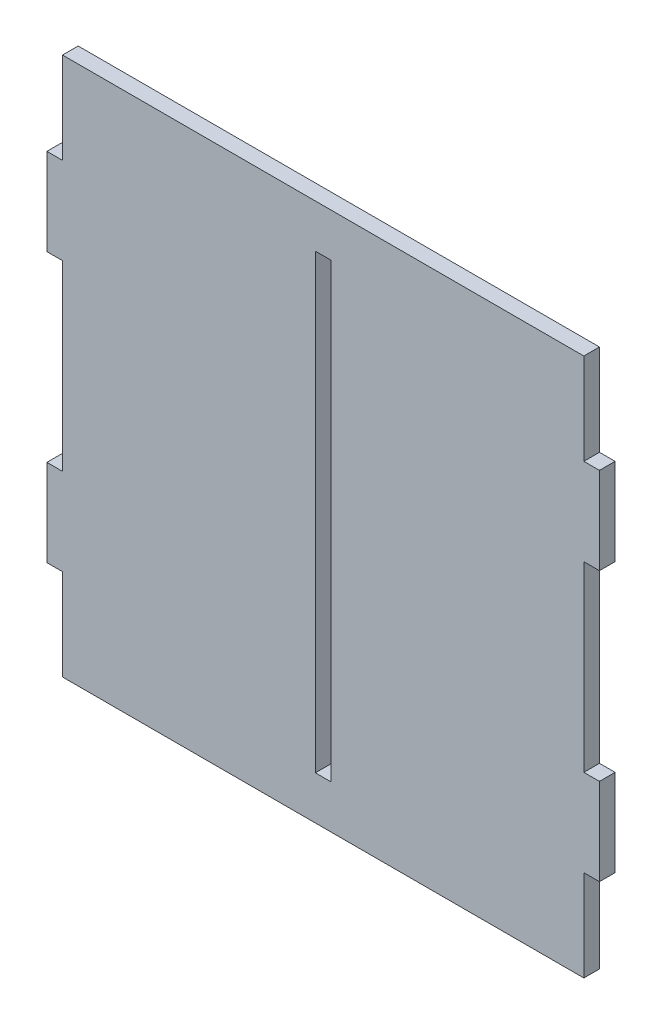
ISO-10303-21;
HEADER;
FILE_DESCRIPTION(('STEP AP214'),'2;1');
FILE_NAME('part.step','',(''),(''),'','','');
FILE_SCHEMA(('AUTOMOTIVE_DESIGN { 1 0 10303 214 1 1 1 1 }'));
ENDSEC;
DATA;
#1=APPLICATION_CONTEXT('core data for automotive mechanical design processes');
#2=APPLICATION_PROTOCOL_DEFINITION('international standard','automotive_design',2000,#1);
#3=PRODUCT_CONTEXT('',#1,'mechanical');
#4=PRODUCT('Part','Part','',(#3));
#5=PRODUCT_RELATED_PRODUCT_CATEGORY('part','',(#4));
#6=PRODUCT_DEFINITION_FORMATION('','',#4);
#7=PRODUCT_DEFINITION_CONTEXT('part definition',#1,'design');
#8=PRODUCT_DEFINITION('design','',#6,#7);
#9=PRODUCT_DEFINITION_SHAPE('','',#8);
#10=(LENGTH_UNIT() NAMED_UNIT(*) SI_UNIT(.MILLI.,.METRE.));
#11=(NAMED_UNIT(*) PLANE_ANGLE_UNIT() SI_UNIT($,.RADIAN.));
#12=(NAMED_UNIT(*) SI_UNIT($,.STERADIAN.) SOLID_ANGLE_UNIT());
#13=UNCERTAINTY_MEASURE_WITH_UNIT(LENGTH_MEASURE(1.E-05),#10,'distance_accuracy_value','');
#14=(GEOMETRIC_REPRESENTATION_CONTEXT(3) GLOBAL_UNCERTAINTY_ASSIGNED_CONTEXT((#13)) GLOBAL_UNIT_ASSIGNED_CONTEXT((#10,
#11,#12)) REPRESENTATION_CONTEXT('',''));
#15=CARTESIAN_POINT('',(0.,0.,0.));
#16=DIRECTION('',(0.,0.,1.));
#17=DIRECTION('',(1.,0.,0.));
#18=AXIS2_PLACEMENT_3D('',#15,#16,#17);
#19=CARTESIAN_POINT('',(0.,0.,18.));
#20=DIRECTION('',(0.,0.,1.));
#21=DIRECTION('',(1.,0.,0.));
#22=AXIS2_PLACEMENT_3D('',#19,#20,#21);
#23=PLANE('',#22);
#24=DIRECTION('',(0.,-1.,0.));
#25=VECTOR('',#24,1.);
#26=CARTESIAN_POINT('',(0.,0.,18.));
#27=LINE('',#26,#25);
#28=CARTESIAN_POINT('',(0.,0.,18.));
#29=VERTEX_POINT('',#28);
#30=CARTESIAN_POINT('',(0.,-105.,18.));
#31=VERTEX_POINT('',#30);
#32=EDGE_CURVE('E221',#29,#31,#27,.T.);
#33=ORIENTED_EDGE('',*,*,#32,.T.);
#34=DIRECTION('',(1.,0.,0.));
#35=VECTOR('',#34,1.);
#36=CARTESIAN_POINT('',(-18.,-105.,18.));
#37=LINE('',#36,#35);
#38=CARTESIAN_POINT('',(-18.,-105.,18.));
#39=VERTEX_POINT('',#38);
#40=EDGE_CURVE('E223',#39,#31,#37,.T.);
#41=ORIENTED_EDGE('',*,*,#40,.F.);
#42=DIRECTION('',(0.,-1.,0.));
#43=VECTOR('',#42,1.);
#44=CARTESIAN_POINT('',(-18.,-105.,18.));
#45=LINE('',#44,#43);
#46=CARTESIAN_POINT('',(-18.,-205.,18.));
#47=VERTEX_POINT('',#46);
#48=EDGE_CURVE('E227',#39,#47,#45,.T.);
#49=ORIENTED_EDGE('',*,*,#48,.T.);
#50=DIRECTION('',(1.,0.,0.));
#51=VECTOR('',#50,1.);
#52=CARTESIAN_POINT('',(-18.,-205.,18.));
#53=LINE('',#52,#51);
#54=CARTESIAN_POINT('',(0.,-205.,18.));
#55=VERTEX_POINT('',#54);
#56=EDGE_CURVE('E229',#47,#55,#53,.T.);
#57=ORIENTED_EDGE('',*,*,#56,.T.);
#58=DIRECTION('',(0.,-1.,0.));
#59=VECTOR('',#58,1.);
#60=CARTESIAN_POINT('',(0.,-205.,18.));
#61=LINE('',#60,#59);
#62=CARTESIAN_POINT('',(0.,-415.,18.));
#63=VERTEX_POINT('',#62);
#64=EDGE_CURVE('E231',#55,#63,#61,.T.);
#65=ORIENTED_EDGE('',*,*,#64,.T.);
#66=DIRECTION('',(1.,0.,0.));
#67=VECTOR('',#66,1.);
#68=CARTESIAN_POINT('',(-18.,-415.,18.));
#69=LINE('',#68,#67);
#70=CARTESIAN_POINT('',(-18.,-415.,18.));
#71=VERTEX_POINT('',#70);
#72=EDGE_CURVE('E233',#71,#63,#69,.T.);
#73=ORIENTED_EDGE('',*,*,#72,.F.);
#74=DIRECTION('',(0.,1.,0.));
#75=VECTOR('',#74,1.);
#76=CARTESIAN_POINT('',(-18.,-515.,18.));
#77=LINE('',#76,#75);
#78=CARTESIAN_POINT('',(-18.,-515.,18.));
#79=VERTEX_POINT('',#78);
#80=EDGE_CURVE('E236',#79,#71,#77,.T.);
#81=ORIENTED_EDGE('',*,*,#80,.F.);
#82=DIRECTION('',(1.,0.,0.));
#83=VECTOR('',#82,1.);
#84=CARTESIAN_POINT('',(-18.,-515.,18.));
#85=LINE('',#84,#83);
#86=CARTESIAN_POINT('',(0.,-515.,18.));
#87=VERTEX_POINT('',#86);
#88=EDGE_CURVE('E239',#79,#87,#85,.T.);
#89=ORIENTED_EDGE('',*,*,#88,.T.);
#90=DIRECTION('',(0.,1.,0.));
#91=VECTOR('',#90,1.);
#92=CARTESIAN_POINT('',(0.,-620.,18.));
#93=LINE('',#92,#91);
#94=CARTESIAN_POINT('',(0.,-620.,18.));
#95=VERTEX_POINT('',#94);
#96=EDGE_CURVE('E241',#95,#87,#93,.T.);
#97=ORIENTED_EDGE('',*,*,#96,.F.);
#98=DIRECTION('',(1.,0.,0.));
#99=VECTOR('',#98,1.);
#100=CARTESIAN_POINT('',(0.,-620.,18.));
#101=LINE('',#100,#99);
#102=CARTESIAN_POINT('',(600.,-620.,18.));
#103=VERTEX_POINT('',#102);
#104=EDGE_CURVE('E244',#95,#103,#101,.T.);
#105=ORIENTED_EDGE('',*,*,#104,.T.);
#106=DIRECTION('',(0.,1.,0.));
#107=VECTOR('',#106,1.);
#108=CARTESIAN_POINT('',(600.,-620.,18.));
#109=LINE('',#108,#107);
#110=CARTESIAN_POINT('',(600.,-515.,18.));
#111=VERTEX_POINT('',#110);
#112=EDGE_CURVE('E246',#103,#111,#109,.T.);
#113=ORIENTED_EDGE('',*,*,#112,.T.);
#114=DIRECTION('',(-1.,0.,0.));
#115=VECTOR('',#114,1.);
#116=CARTESIAN_POINT('',(618.,-515.,18.));
#117=LINE('',#116,#115);
#118=CARTESIAN_POINT('',(618.,-515.,18.));
#119=VERTEX_POINT('',#118);
#120=EDGE_CURVE('E248',#119,#111,#117,.T.);
#121=ORIENTED_EDGE('',*,*,#120,.F.);
#122=DIRECTION('',(0.,1.,0.));
#123=VECTOR('',#122,1.);
#124=CARTESIAN_POINT('',(618.,-515.,18.));
#125=LINE('',#124,#123);
#126=CARTESIAN_POINT('',(618.,-415.,18.));
#127=VERTEX_POINT('',#126);
#128=EDGE_CURVE('E251',#119,#127,#125,.T.);
#129=ORIENTED_EDGE('',*,*,#128,.T.);
#130=DIRECTION('',(-1.,0.,0.));
#131=VECTOR('',#130,1.);
#132=CARTESIAN_POINT('',(618.,-415.,18.));
#133=LINE('',#132,#131);
#134=CARTESIAN_POINT('',(600.,-415.,18.));
#135=VERTEX_POINT('',#134);
#136=EDGE_CURVE('E253',#127,#135,#133,.T.);
#137=ORIENTED_EDGE('',*,*,#136,.T.);
#138=DIRECTION('',(0.,-1.,0.));
#139=VECTOR('',#138,1.);
#140=CARTESIAN_POINT('',(600.,-205.,18.));
#141=LINE('',#140,#139);
#142=CARTESIAN_POINT('',(600.,-205.,18.));
#143=VERTEX_POINT('',#142);
#144=EDGE_CURVE('E255',#143,#135,#141,.T.);
#145=ORIENTED_EDGE('',*,*,#144,.F.);
#146=DIRECTION('',(-1.,0.,0.));
#147=VECTOR('',#146,1.);
#148=CARTESIAN_POINT('',(618.,-205.,18.));
#149=LINE('',#148,#147);
#150=CARTESIAN_POINT('',(618.,-205.,18.));
#151=VERTEX_POINT('',#150);
#152=EDGE_CURVE('E258',#151,#143,#149,.T.);
#153=ORIENTED_EDGE('',*,*,#152,.F.);
#154=DIRECTION('',(0.,-1.,0.));
#155=VECTOR('',#154,1.);
#156=CARTESIAN_POINT('',(618.,-105.,18.));
#157=LINE('',#156,#155);
#158=CARTESIAN_POINT('',(618.,-105.,18.));
#159=VERTEX_POINT('',#158);
#160=EDGE_CURVE('E261',#159,#151,#157,.T.);
#161=ORIENTED_EDGE('',*,*,#160,.F.);
#162=DIRECTION('',(-1.,0.,0.));
#163=VECTOR('',#162,1.);
#164=CARTESIAN_POINT('',(618.,-105.,18.));
#165=LINE('',#164,#163);
#166=CARTESIAN_POINT('',(600.,-105.,18.));
#167=VERTEX_POINT('',#166);
#168=EDGE_CURVE('E264',#159,#167,#165,.T.);
#169=ORIENTED_EDGE('',*,*,#168,.T.);
#170=DIRECTION('',(0.,-1.,0.));
#171=VECTOR('',#170,1.);
#172=CARTESIAN_POINT('',(600.,0.,18.));
#173=LINE('',#172,#171);
#174=CARTESIAN_POINT('',(600.,0.,18.));
#175=VERTEX_POINT('',#174);
#176=EDGE_CURVE('E266',#175,#167,#173,.T.);
#177=ORIENTED_EDGE('',*,*,#176,.F.);
#178=DIRECTION('',(1.,0.,0.));
#179=VECTOR('',#178,1.);
#180=CARTESIAN_POINT('',(0.,0.,18.));
#181=LINE('',#180,#179);
#182=EDGE_CURVE('E269',#29,#175,#181,.T.);
#183=ORIENTED_EDGE('',*,*,#182,.F.);
#184=EDGE_LOOP('',(#33,#41,#49,#57,#65,#73,#81,#89,#97,#105,#113,#121,#129,#137,#145,#153,#161,
#169,#177,#183));
#185=FACE_BOUND('',#184,.T.);
#186=DIRECTION('',(1.,0.,0.));
#187=VECTOR('',#186,1.);
#188=CARTESIAN_POINT('',(291.,-570.000000000002,18.));
#189=LINE('',#188,#187);
#190=CARTESIAN_POINT('',(291.,-570.000000000002,18.));
#191=VERTEX_POINT('',#190);
#192=CARTESIAN_POINT('',(309.,-570.000000000001,18.));
#193=VERTEX_POINT('',#192);
#194=EDGE_CURVE('E203',#191,#193,#189,.T.);
#195=ORIENTED_EDGE('',*,*,#194,.F.);
#196=DIRECTION('',(0.,-1.,0.));
#197=VECTOR('',#196,1.);
#198=CARTESIAN_POINT('',(291.,-50.0000000000002,18.));
#199=LINE('',#198,#197);
#200=CARTESIAN_POINT('',(291.,-50.0000000000002,18.));
#201=VERTEX_POINT('',#200);
#202=EDGE_CURVE('E195',#201,#191,#199,.T.);
#203=ORIENTED_EDGE('',*,*,#202,.F.);
#204=DIRECTION('',(1.,0.,0.));
#205=VECTOR('',#204,1.);
#206=CARTESIAN_POINT('',(291.,-50.0000000000002,18.));
#207=LINE('',#206,#205);
#208=CARTESIAN_POINT('',(309.,-50.0000000000002,18.));
#209=VERTEX_POINT('',#208);
#210=EDGE_CURVE('E213',#201,#209,#207,.T.);
#211=ORIENTED_EDGE('',*,*,#210,.T.);
#212=DIRECTION('',(0.,-1.,0.));
#213=VECTOR('',#212,1.);
#214=CARTESIAN_POINT('',(309.,-50.0000000000002,18.));
#215=LINE('',#214,#213);
#216=EDGE_CURVE('E48',#209,#193,#215,.T.);
#217=ORIENTED_EDGE('',*,*,#216,.T.);
#218=EDGE_LOOP('',(#195,#203,#211,#217));
#219=FACE_BOUND('',#218,.T.);
#220=ADVANCED_FACE('F33',(#185,#219),#23,.T.);
#221=CARTESIAN_POINT('',(0.,0.,0.));
#222=DIRECTION('',(0.,0.,1.));
#223=DIRECTION('',(1.,0.,0.));
#224=AXIS2_PLACEMENT_3D('',#221,#222,#223);
#225=PLANE('',#224);
#226=DIRECTION('',(0.,-1.,0.));
#227=VECTOR('',#226,1.);
#228=CARTESIAN_POINT('',(0.,0.,0.));
#229=LINE('',#228,#227);
#230=CARTESIAN_POINT('',(0.,0.,0.));
#231=VERTEX_POINT('',#230);
#232=CARTESIAN_POINT('',(0.,-105.,0.));
#233=VERTEX_POINT('',#232);
#234=EDGE_CURVE('E209',#231,#233,#229,.T.);
#235=ORIENTED_EDGE('',*,*,#234,.F.);
#236=DIRECTION('',(1.,0.,0.));
#237=VECTOR('',#236,1.);
#238=CARTESIAN_POINT('',(0.,0.,0.));
#239=LINE('',#238,#237);
#240=CARTESIAN_POINT('',(600.,0.,0.));
#241=VERTEX_POINT('',#240);
#242=EDGE_CURVE('E224',#231,#241,#239,.T.);
#243=ORIENTED_EDGE('',*,*,#242,.T.);
#244=DIRECTION('',(0.,-1.,0.));
#245=VECTOR('',#244,1.);
#246=CARTESIAN_POINT('',(600.,0.,0.));
#247=LINE('',#246,#245);
#248=CARTESIAN_POINT('',(600.,-105.,0.));
#249=VERTEX_POINT('',#248);
#250=EDGE_CURVE('E322',#241,#249,#247,.T.);
#251=ORIENTED_EDGE('',*,*,#250,.T.);
#252=DIRECTION('',(-1.,0.,0.));
#253=VECTOR('',#252,1.);
#254=CARTESIAN_POINT('',(618.,-105.,0.));
#255=LINE('',#254,#253);
#256=CARTESIAN_POINT('',(618.,-105.,0.));
#257=VERTEX_POINT('',#256);
#258=EDGE_CURVE('E319',#257,#249,#255,.T.);
#259=ORIENTED_EDGE('',*,*,#258,.F.);
#260=DIRECTION('',(0.,-1.,0.));
#261=VECTOR('',#260,1.);
#262=CARTESIAN_POINT('',(618.,-105.,0.));
#263=LINE('',#262,#261);
#264=CARTESIAN_POINT('',(618.,-205.,0.));
#265=VERTEX_POINT('',#264);
#266=EDGE_CURVE('E316',#257,#265,#263,.T.);
#267=ORIENTED_EDGE('',*,*,#266,.T.);
#268=DIRECTION('',(-1.,0.,0.));
#269=VECTOR('',#268,1.);
#270=CARTESIAN_POINT('',(618.,-205.,0.));
#271=LINE('',#270,#269);
#272=CARTESIAN_POINT('',(600.,-205.,0.));
#273=VERTEX_POINT('',#272);
#274=EDGE_CURVE('E313',#265,#273,#271,.T.);
#275=ORIENTED_EDGE('',*,*,#274,.T.);
#276=DIRECTION('',(0.,-1.,0.));
#277=VECTOR('',#276,1.);
#278=CARTESIAN_POINT('',(600.,-205.,0.));
#279=LINE('',#278,#277);
#280=CARTESIAN_POINT('',(600.,-415.,0.));
#281=VERTEX_POINT('',#280);
#282=EDGE_CURVE('E310',#273,#281,#279,.T.);
#283=ORIENTED_EDGE('',*,*,#282,.T.);
#284=DIRECTION('',(-1.,0.,0.));
#285=VECTOR('',#284,1.);
#286=CARTESIAN_POINT('',(618.,-415.,0.));
#287=LINE('',#286,#285);
#288=CARTESIAN_POINT('',(618.,-415.,0.));
#289=VERTEX_POINT('',#288);
#290=EDGE_CURVE('E307',#289,#281,#287,.T.);
#291=ORIENTED_EDGE('',*,*,#290,.F.);
#292=DIRECTION('',(0.,1.,0.));
#293=VECTOR('',#292,1.);
#294=CARTESIAN_POINT('',(618.,-515.,0.));
#295=LINE('',#294,#293);
#296=CARTESIAN_POINT('',(618.,-515.,0.));
#297=VERTEX_POINT('',#296);
#298=EDGE_CURVE('E305',#297,#289,#295,.T.);
#299=ORIENTED_EDGE('',*,*,#298,.F.);
#300=DIRECTION('',(-1.,0.,0.));
#301=VECTOR('',#300,1.);
#302=CARTESIAN_POINT('',(618.,-515.,0.));
#303=LINE('',#302,#301);
#304=CARTESIAN_POINT('',(600.,-515.,0.));
#305=VERTEX_POINT('',#304);
#306=EDGE_CURVE('E302',#297,#305,#303,.T.);
#307=ORIENTED_EDGE('',*,*,#306,.T.);
#308=DIRECTION('',(0.,1.,0.));
#309=VECTOR('',#308,1.);
#310=CARTESIAN_POINT('',(600.,-620.,0.));
#311=LINE('',#310,#309);
#312=CARTESIAN_POINT('',(600.,-620.,0.));
#313=VERTEX_POINT('',#312);
#314=EDGE_CURVE('E299',#313,#305,#311,.T.);
#315=ORIENTED_EDGE('',*,*,#314,.F.);
#316=DIRECTION('',(1.,0.,0.));
#317=VECTOR('',#316,1.);
#318=CARTESIAN_POINT('',(0.,-620.,0.));
#319=LINE('',#318,#317);
#320=CARTESIAN_POINT('',(0.,-620.,0.));
#321=VERTEX_POINT('',#320);
#322=EDGE_CURVE('E297',#321,#313,#319,.T.);
#323=ORIENTED_EDGE('',*,*,#322,.F.);
#324=DIRECTION('',(0.,1.,0.));
#325=VECTOR('',#324,1.);
#326=CARTESIAN_POINT('',(0.,-620.,0.));
#327=LINE('',#326,#325);
#328=CARTESIAN_POINT('',(0.,-515.,0.));
#329=VERTEX_POINT('',#328);
#330=EDGE_CURVE('E294',#321,#329,#327,.T.);
#331=ORIENTED_EDGE('',*,*,#330,.T.);
#332=DIRECTION('',(1.,0.,0.));
#333=VECTOR('',#332,1.);
#334=CARTESIAN_POINT('',(-18.,-515.,0.));
#335=LINE('',#334,#333);
#336=CARTESIAN_POINT('',(-18.,-515.,0.));
#337=VERTEX_POINT('',#336);
#338=EDGE_CURVE('E291',#337,#329,#335,.T.);
#339=ORIENTED_EDGE('',*,*,#338,.F.);
#340=DIRECTION('',(0.,1.,0.));
#341=VECTOR('',#340,1.);
#342=CARTESIAN_POINT('',(-18.,-515.,0.));
#343=LINE('',#342,#341);
#344=CARTESIAN_POINT('',(-18.,-415.,0.));
#345=VERTEX_POINT('',#344);
#346=EDGE_CURVE('E288',#337,#345,#343,.T.);
#347=ORIENTED_EDGE('',*,*,#346,.T.);
#348=DIRECTION('',(1.,0.,0.));
#349=VECTOR('',#348,1.);
#350=CARTESIAN_POINT('',(-18.,-415.,0.));
#351=LINE('',#350,#349);
#352=CARTESIAN_POINT('',(0.,-415.,0.));
#353=VERTEX_POINT('',#352);
#354=EDGE_CURVE('E285',#345,#353,#351,.T.);
#355=ORIENTED_EDGE('',*,*,#354,.T.);
#356=DIRECTION('',(0.,-1.,0.));
#357=VECTOR('',#356,1.);
#358=CARTESIAN_POINT('',(0.,-205.,0.));
#359=LINE('',#358,#357);
#360=CARTESIAN_POINT('',(0.,-205.,0.));
#361=VERTEX_POINT('',#360);
#362=EDGE_CURVE('E282',#361,#353,#359,.T.);
#363=ORIENTED_EDGE('',*,*,#362,.F.);
#364=DIRECTION('',(1.,0.,0.));
#365=VECTOR('',#364,1.);
#366=CARTESIAN_POINT('',(-18.,-205.,0.));
#367=LINE('',#366,#365);
#368=CARTESIAN_POINT('',(-18.,-205.,0.));
#369=VERTEX_POINT('',#368);
#370=EDGE_CURVE('E280',#369,#361,#367,.T.);
#371=ORIENTED_EDGE('',*,*,#370,.F.);
#372=DIRECTION('',(0.,-1.,0.));
#373=VECTOR('',#372,1.);
#374=CARTESIAN_POINT('',(-18.,-105.,0.));
#375=LINE('',#374,#373);
#376=CARTESIAN_POINT('',(-18.,-105.,0.));
#377=VERTEX_POINT('',#376);
#378=EDGE_CURVE('E278',#377,#369,#375,.T.);
#379=ORIENTED_EDGE('',*,*,#378,.F.);
#380=DIRECTION('',(1.,0.,0.));
#381=VECTOR('',#380,1.);
#382=CARTESIAN_POINT('',(-18.,-105.,0.));
#383=LINE('',#382,#381);
#384=EDGE_CURVE('E275',#377,#233,#383,.T.);
#385=ORIENTED_EDGE('',*,*,#384,.T.);
#386=EDGE_LOOP('',(#235,#243,#251,#259,#267,#275,#283,#291,#299,#307,#315,#323,#331,#339,#347,
#355,#363,#371,#379,#385));
#387=FACE_BOUND('',#386,.T.);
#388=DIRECTION('',(0.,1.,0.));
#389=VECTOR('',#388,1.);
#390=CARTESIAN_POINT('',(291.,0.,0.));
#391=LINE('',#390,#389);
#392=CARTESIAN_POINT('',(291.,-570.000000000002,0.));
#393=VERTEX_POINT('',#392);
#394=CARTESIAN_POINT('',(291.,-50.0000000000002,0.));
#395=VERTEX_POINT('',#394);
#396=EDGE_CURVE('E11',#393,#395,#391,.T.);
#397=ORIENTED_EDGE('',*,*,#396,.F.);
#398=DIRECTION('',(-1.,0.,0.));
#399=VECTOR('',#398,1.);
#400=CARTESIAN_POINT('',(3.51570624464635E-12,-570.000000000003,0.));
#401=LINE('',#400,#399);
#402=CARTESIAN_POINT('',(309.,-570.000000000001,0.));
#403=VERTEX_POINT('',#402);
#404=EDGE_CURVE('E41',#403,#393,#401,.T.);
#405=ORIENTED_EDGE('',*,*,#404,.F.);
#406=DIRECTION('',(0.,1.,0.));
#407=VECTOR('',#406,1.);
#408=CARTESIAN_POINT('',(309.,0.,0.));
#409=LINE('',#408,#407);
#410=CARTESIAN_POINT('',(309.,-50.0000000000002,0.));
#411=VERTEX_POINT('',#410);
#412=EDGE_CURVE('E373',#403,#411,#409,.T.);
#413=ORIENTED_EDGE('',*,*,#412,.T.);
#414=DIRECTION('',(-1.,0.,0.));
#415=VECTOR('',#414,1.);
#416=CARTESIAN_POINT('',(0.,-50.0000000000003,0.));
#417=LINE('',#416,#415);
#418=EDGE_CURVE('E370',#411,#395,#417,.T.);
#419=ORIENTED_EDGE('',*,*,#418,.T.);
#420=EDGE_LOOP('',(#397,#405,#413,#419));
#421=FACE_BOUND('',#420,.T.);
#422=ADVANCED_FACE('F376',(#387,#421),#225,.F.);
#423=CARTESIAN_POINT('',(0.,0.,18.));
#424=DIRECTION('',(1.,0.,0.));
#425=DIRECTION('',(0.,1.,0.));
#426=AXIS2_PLACEMENT_3D('',#423,#424,#425);
#427=PLANE('',#426);
#428=ORIENTED_EDGE('',*,*,#234,.T.);
#429=DIRECTION('',(0.,0.,-1.));
#430=VECTOR('',#429,1.);
#431=CARTESIAN_POINT('',(0.,-105.,18.));
#432=LINE('',#431,#430);
#433=EDGE_CURVE('E368',#31,#233,#432,.T.);
#434=ORIENTED_EDGE('',*,*,#433,.F.);
#435=ORIENTED_EDGE('',*,*,#32,.F.);
#436=DIRECTION('',(0.,0.,-1.));
#437=VECTOR('',#436,1.);
#438=CARTESIAN_POINT('',(0.,0.,18.));
#439=LINE('',#438,#437);
#440=EDGE_CURVE('E272',#29,#231,#439,.T.);
#441=ORIENTED_EDGE('',*,*,#440,.T.);
#442=EDGE_LOOP('',(#428,#434,#435,#441));
#443=FACE_BOUND('',#442,.T.);
#444=ADVANCED_FACE('F35',(#443),#427,.F.);
#445=CARTESIAN_POINT('',(-18.,-105.,18.));
#446=DIRECTION('',(0.,1.,0.));
#447=DIRECTION('',(0.,0.,1.));
#448=AXIS2_PLACEMENT_3D('',#445,#446,#447);
#449=PLANE('',#448);
#450=ORIENTED_EDGE('',*,*,#384,.F.);
#451=DIRECTION('',(0.,0.,-1.));
#452=VECTOR('',#451,1.);
#453=CARTESIAN_POINT('',(-18.,-105.,18.));
#454=LINE('',#453,#452);
#455=EDGE_CURVE('E366',#39,#377,#454,.T.);
#456=ORIENTED_EDGE('',*,*,#455,.F.);
#457=ORIENTED_EDGE('',*,*,#40,.T.);
#458=ORIENTED_EDGE('',*,*,#433,.T.);
#459=EDGE_LOOP('',(#450,#456,#457,#458));
#460=FACE_BOUND('',#459,.T.);
#461=ADVANCED_FACE('F467',(#460),#449,.T.);
#462=CARTESIAN_POINT('',(-18.,-105.,18.));
#463=DIRECTION('',(1.,0.,0.));
#464=DIRECTION('',(0.,1.,0.));
#465=AXIS2_PLACEMENT_3D('',#462,#463,#464);
#466=PLANE('',#465);
#467=ORIENTED_EDGE('',*,*,#378,.T.);
#468=DIRECTION('',(0.,0.,-1.));
#469=VECTOR('',#468,1.);
#470=CARTESIAN_POINT('',(-18.,-205.,18.));
#471=LINE('',#470,#469);
#472=EDGE_CURVE('E363',#47,#369,#471,.T.);
#473=ORIENTED_EDGE('',*,*,#472,.F.);
#474=ORIENTED_EDGE('',*,*,#48,.F.);
#475=ORIENTED_EDGE('',*,*,#455,.T.);
#476=EDGE_LOOP('',(#467,#473,#474,#475));
#477=FACE_BOUND('',#476,.T.);
#478=ADVANCED_FACE('F464',(#477),#466,.F.);
#479=CARTESIAN_POINT('',(-18.,-205.,18.));
#480=DIRECTION('',(0.,1.,0.));
#481=DIRECTION('',(0.,0.,1.));
#482=AXIS2_PLACEMENT_3D('',#479,#480,#481);
#483=PLANE('',#482);
#484=ORIENTED_EDGE('',*,*,#370,.T.);
#485=DIRECTION('',(0.,0.,-1.));
#486=VECTOR('',#485,1.);
#487=CARTESIAN_POINT('',(0.,-205.,18.));
#488=LINE('',#487,#486);
#489=EDGE_CURVE('E360',#55,#361,#488,.T.);
#490=ORIENTED_EDGE('',*,*,#489,.F.);
#491=ORIENTED_EDGE('',*,*,#56,.F.);
#492=ORIENTED_EDGE('',*,*,#472,.T.);
#493=EDGE_LOOP('',(#484,#490,#491,#492));
#494=FACE_BOUND('',#493,.T.);
#495=ADVANCED_FACE('F460',(#494),#483,.F.);
#496=CARTESIAN_POINT('',(0.,-205.,18.));
#497=DIRECTION('',(1.,0.,0.));
#498=DIRECTION('',(0.,1.,0.));
#499=AXIS2_PLACEMENT_3D('',#496,#497,#498);
#500=PLANE('',#499);
#501=ORIENTED_EDGE('',*,*,#362,.T.);
#502=DIRECTION('',(0.,0.,-1.));
#503=VECTOR('',#502,1.);
#504=CARTESIAN_POINT('',(0.,-415.,18.));
#505=LINE('',#504,#503);
#506=EDGE_CURVE('E358',#63,#353,#505,.T.);
#507=ORIENTED_EDGE('',*,*,#506,.F.);
#508=ORIENTED_EDGE('',*,*,#64,.F.);
#509=ORIENTED_EDGE('',*,*,#489,.T.);
#510=EDGE_LOOP('',(#501,#507,#508,#509));
#511=FACE_BOUND('',#510,.T.);
#512=ADVANCED_FACE('F456',(#511),#500,.F.);
#513=CARTESIAN_POINT('',(-18.,-415.,18.));
#514=DIRECTION('',(0.,1.,0.));
#515=DIRECTION('',(0.,0.,1.));
#516=AXIS2_PLACEMENT_3D('',#513,#514,#515);
#517=PLANE('',#516);
#518=ORIENTED_EDGE('',*,*,#354,.F.);
#519=DIRECTION('',(0.,0.,-1.));
#520=VECTOR('',#519,1.);
#521=CARTESIAN_POINT('',(-18.,-415.,18.));
#522=LINE('',#521,#520);
#523=EDGE_CURVE('E356',#71,#345,#522,.T.);
#524=ORIENTED_EDGE('',*,*,#523,.F.);
#525=ORIENTED_EDGE('',*,*,#72,.T.);
#526=ORIENTED_EDGE('',*,*,#506,.T.);
#527=EDGE_LOOP('',(#518,#524,#525,#526));
#528=FACE_BOUND('',#527,.T.);
#529=ADVANCED_FACE('F452',(#528),#517,.T.);
#530=CARTESIAN_POINT('',(-18.,-515.,18.));
#531=DIRECTION('',(-1.,0.,0.));
#532=DIRECTION('',(0.,0.,1.));
#533=AXIS2_PLACEMENT_3D('',#530,#531,#532);
#534=PLANE('',#533);
#535=ORIENTED_EDGE('',*,*,#346,.F.);
#536=DIRECTION('',(0.,0.,-1.));
#537=VECTOR('',#536,1.);
#538=CARTESIAN_POINT('',(-18.,-515.,18.));
#539=LINE('',#538,#537);
#540=EDGE_CURVE('E354',#79,#337,#539,.T.);
#541=ORIENTED_EDGE('',*,*,#540,.F.);
#542=ORIENTED_EDGE('',*,*,#80,.T.);
#543=ORIENTED_EDGE('',*,*,#523,.T.);
#544=EDGE_LOOP('',(#535,#541,#542,#543));
#545=FACE_BOUND('',#544,.T.);
#546=ADVANCED_FACE('F448',(#545),#534,.T.);
#547=CARTESIAN_POINT('',(-18.,-515.,18.));
#548=DIRECTION('',(0.,1.,0.));
#549=DIRECTION('',(0.,0.,1.));
#550=AXIS2_PLACEMENT_3D('',#547,#548,#549);
#551=PLANE('',#550);
#552=ORIENTED_EDGE('',*,*,#338,.T.);
#553=DIRECTION('',(0.,0.,-1.));
#554=VECTOR('',#553,1.);
#555=CARTESIAN_POINT('',(0.,-515.,18.));
#556=LINE('',#555,#554);
#557=EDGE_CURVE('E352',#87,#329,#556,.T.);
#558=ORIENTED_EDGE('',*,*,#557,.F.);
#559=ORIENTED_EDGE('',*,*,#88,.F.);
#560=ORIENTED_EDGE('',*,*,#540,.T.);
#561=EDGE_LOOP('',(#552,#558,#559,#560));
#562=FACE_BOUND('',#561,.T.);
#563=ADVANCED_FACE('F444',(#562),#551,.F.);
#564=CARTESIAN_POINT('',(0.,-620.,18.));
#565=DIRECTION('',(-1.,0.,0.));
#566=DIRECTION('',(0.,-1.,0.));
#567=AXIS2_PLACEMENT_3D('',#564,#565,#566);
#568=PLANE('',#567);
#569=ORIENTED_EDGE('',*,*,#330,.F.);
#570=DIRECTION('',(0.,0.,-1.));
#571=VECTOR('',#570,1.);
#572=CARTESIAN_POINT('',(0.,-620.,18.));
#573=LINE('',#572,#571);
#574=EDGE_CURVE('E350',#95,#321,#573,.T.);
#575=ORIENTED_EDGE('',*,*,#574,.F.);
#576=ORIENTED_EDGE('',*,*,#96,.T.);
#577=ORIENTED_EDGE('',*,*,#557,.T.);
#578=EDGE_LOOP('',(#569,#575,#576,#577));
#579=FACE_BOUND('',#578,.T.);
#580=ADVANCED_FACE('F440',(#579),#568,.T.);
#581=CARTESIAN_POINT('',(0.,-620.,18.));
#582=DIRECTION('',(0.,1.,0.));
#583=DIRECTION('',(-1.,0.,0.));
#584=AXIS2_PLACEMENT_3D('',#581,#582,#583);
#585=PLANE('',#584);
#586=ORIENTED_EDGE('',*,*,#322,.T.);
#587=DIRECTION('',(0.,0.,-1.));
#588=VECTOR('',#587,1.);
#589=CARTESIAN_POINT('',(600.,-620.,18.));
#590=LINE('',#589,#588);
#591=EDGE_CURVE('E347',#103,#313,#590,.T.);
#592=ORIENTED_EDGE('',*,*,#591,.F.);
#593=ORIENTED_EDGE('',*,*,#104,.F.);
#594=ORIENTED_EDGE('',*,*,#574,.T.);
#595=EDGE_LOOP('',(#586,#592,#593,#594));
#596=FACE_BOUND('',#595,.T.);
#597=ADVANCED_FACE('F436',(#596),#585,.F.);
#598=CARTESIAN_POINT('',(600.,-620.,18.));
#599=DIRECTION('',(-1.,0.,0.));
#600=DIRECTION('',(0.,0.,1.));
#601=AXIS2_PLACEMENT_3D('',#598,#599,#600);
#602=PLANE('',#601);
#603=ORIENTED_EDGE('',*,*,#314,.T.);
#604=DIRECTION('',(0.,0.,-1.));
#605=VECTOR('',#604,1.);
#606=CARTESIAN_POINT('',(600.,-515.,18.));
#607=LINE('',#606,#605);
#608=EDGE_CURVE('E345',#111,#305,#607,.T.);
#609=ORIENTED_EDGE('',*,*,#608,.F.);
#610=ORIENTED_EDGE('',*,*,#112,.F.);
#611=ORIENTED_EDGE('',*,*,#591,.T.);
#612=EDGE_LOOP('',(#603,#609,#610,#611));
#613=FACE_BOUND('',#612,.T.);
#614=ADVANCED_FACE('F432',(#613),#602,.F.);
#615=CARTESIAN_POINT('',(618.,-515.,18.));
#616=DIRECTION('',(0.,-1.,0.));
#617=DIRECTION('',(1.,0.,0.));
#618=AXIS2_PLACEMENT_3D('',#615,#616,#617);
#619=PLANE('',#618);
#620=ORIENTED_EDGE('',*,*,#306,.F.);
#621=DIRECTION('',(0.,0.,-1.));
#622=VECTOR('',#621,1.);
#623=CARTESIAN_POINT('',(618.,-515.,18.));
#624=LINE('',#623,#622);
#625=EDGE_CURVE('E343',#119,#297,#624,.T.);
#626=ORIENTED_EDGE('',*,*,#625,.F.);
#627=ORIENTED_EDGE('',*,*,#120,.T.);
#628=ORIENTED_EDGE('',*,*,#608,.T.);
#629=EDGE_LOOP('',(#620,#626,#627,#628));
#630=FACE_BOUND('',#629,.T.);
#631=ADVANCED_FACE('F428',(#630),#619,.T.);
#632=CARTESIAN_POINT('',(618.,-515.,18.));
#633=DIRECTION('',(-1.,0.,0.));
#634=DIRECTION('',(0.,0.,1.));
#635=AXIS2_PLACEMENT_3D('',#632,#633,#634);
#636=PLANE('',#635);
#637=ORIENTED_EDGE('',*,*,#298,.T.);
#638=DIRECTION('',(0.,0.,-1.));
#639=VECTOR('',#638,1.);
#640=CARTESIAN_POINT('',(618.,-415.,18.));
#641=LINE('',#640,#639);
#642=EDGE_CURVE('E340',#127,#289,#641,.T.);
#643=ORIENTED_EDGE('',*,*,#642,.F.);
#644=ORIENTED_EDGE('',*,*,#128,.F.);
#645=ORIENTED_EDGE('',*,*,#625,.T.);
#646=EDGE_LOOP('',(#637,#643,#644,#645));
#647=FACE_BOUND('',#646,.T.);
#648=ADVANCED_FACE('F424',(#647),#636,.F.);
#649=CARTESIAN_POINT('',(618.,-415.,18.));
#650=DIRECTION('',(0.,-1.,0.));
#651=DIRECTION('',(0.,0.,-1.));
#652=AXIS2_PLACEMENT_3D('',#649,#650,#651);
#653=PLANE('',#652);
#654=ORIENTED_EDGE('',*,*,#290,.T.);
#655=DIRECTION('',(0.,0.,-1.));
#656=VECTOR('',#655,1.);
#657=CARTESIAN_POINT('',(600.,-415.,18.));
#658=LINE('',#657,#656);
#659=EDGE_CURVE('E338',#135,#281,#658,.T.);
#660=ORIENTED_EDGE('',*,*,#659,.F.);
#661=ORIENTED_EDGE('',*,*,#136,.F.);
#662=ORIENTED_EDGE('',*,*,#642,.T.);
#663=EDGE_LOOP('',(#654,#660,#661,#662));
#664=FACE_BOUND('',#663,.T.);
#665=ADVANCED_FACE('F420',(#664),#653,.F.);
#666=CARTESIAN_POINT('',(600.,-205.,18.));
#667=DIRECTION('',(1.,0.,0.));
#668=DIRECTION('',(0.,1.,0.));
#669=AXIS2_PLACEMENT_3D('',#666,#667,#668);
#670=PLANE('',#669);
#671=ORIENTED_EDGE('',*,*,#282,.F.);
#672=DIRECTION('',(0.,0.,-1.));
#673=VECTOR('',#672,1.);
#674=CARTESIAN_POINT('',(600.,-205.,18.));
#675=LINE('',#674,#673);
#676=EDGE_CURVE('E336',#143,#273,#675,.T.);
#677=ORIENTED_EDGE('',*,*,#676,.F.);
#678=ORIENTED_EDGE('',*,*,#144,.T.);
#679=ORIENTED_EDGE('',*,*,#659,.T.);
#680=EDGE_LOOP('',(#671,#677,#678,#679));
#681=FACE_BOUND('',#680,.T.);
#682=ADVANCED_FACE('F416',(#681),#670,.T.);
#683=CARTESIAN_POINT('',(618.,-205.,18.));
#684=DIRECTION('',(0.,-1.,0.));
#685=DIRECTION('',(0.,0.,-1.));
#686=AXIS2_PLACEMENT_3D('',#683,#684,#685);
#687=PLANE('',#686);
#688=ORIENTED_EDGE('',*,*,#274,.F.);
#689=DIRECTION('',(0.,0.,-1.));
#690=VECTOR('',#689,1.);
#691=CARTESIAN_POINT('',(618.,-205.,18.));
#692=LINE('',#691,#690);
#693=EDGE_CURVE('E334',#151,#265,#692,.T.);
#694=ORIENTED_EDGE('',*,*,#693,.F.);
#695=ORIENTED_EDGE('',*,*,#152,.T.);
#696=ORIENTED_EDGE('',*,*,#676,.T.);
#697=EDGE_LOOP('',(#688,#694,#695,#696));
#698=FACE_BOUND('',#697,.T.);
#699=ADVANCED_FACE('F412',(#698),#687,.T.);
#700=CARTESIAN_POINT('',(618.,-105.,18.));
#701=DIRECTION('',(1.,0.,0.));
#702=DIRECTION('',(0.,0.,-1.));
#703=AXIS2_PLACEMENT_3D('',#700,#701,#702);
#704=PLANE('',#703);
#705=ORIENTED_EDGE('',*,*,#266,.F.);
#706=DIRECTION('',(0.,0.,-1.));
#707=VECTOR('',#706,1.);
#708=CARTESIAN_POINT('',(618.,-105.,18.));
#709=LINE('',#708,#707);
#710=EDGE_CURVE('E332',#159,#257,#709,.T.);
#711=ORIENTED_EDGE('',*,*,#710,.F.);
#712=ORIENTED_EDGE('',*,*,#160,.T.);
#713=ORIENTED_EDGE('',*,*,#693,.T.);
#714=EDGE_LOOP('',(#705,#711,#712,#713));
#715=FACE_BOUND('',#714,.T.);
#716=ADVANCED_FACE('F408',(#715),#704,.T.);
#717=CARTESIAN_POINT('',(618.,-105.,18.));
#718=DIRECTION('',(0.,-1.,0.));
#719=DIRECTION('',(0.,0.,-1.));
#720=AXIS2_PLACEMENT_3D('',#717,#718,#719);
#721=PLANE('',#720);
#722=ORIENTED_EDGE('',*,*,#258,.T.);
#723=DIRECTION('',(0.,0.,-1.));
#724=VECTOR('',#723,1.);
#725=CARTESIAN_POINT('',(600.,-105.,18.));
#726=LINE('',#725,#724);
#727=EDGE_CURVE('E330',#167,#249,#726,.T.);
#728=ORIENTED_EDGE('',*,*,#727,.F.);
#729=ORIENTED_EDGE('',*,*,#168,.F.);
#730=ORIENTED_EDGE('',*,*,#710,.T.);
#731=EDGE_LOOP('',(#722,#728,#729,#730));
#732=FACE_BOUND('',#731,.T.);
#733=ADVANCED_FACE('F404',(#732),#721,.F.);
#734=CARTESIAN_POINT('',(600.,0.,18.));
#735=DIRECTION('',(1.,0.,0.));
#736=DIRECTION('',(0.,0.,-1.));
#737=AXIS2_PLACEMENT_3D('',#734,#735,#736);
#738=PLANE('',#737);
#739=ORIENTED_EDGE('',*,*,#250,.F.);
#740=DIRECTION('',(0.,0.,-1.));
#741=VECTOR('',#740,1.);
#742=CARTESIAN_POINT('',(600.,0.,18.));
#743=LINE('',#742,#741);
#744=EDGE_CURVE('E328',#175,#241,#743,.T.);
#745=ORIENTED_EDGE('',*,*,#744,.F.);
#746=ORIENTED_EDGE('',*,*,#176,.T.);
#747=ORIENTED_EDGE('',*,*,#727,.T.);
#748=EDGE_LOOP('',(#739,#745,#746,#747));
#749=FACE_BOUND('',#748,.T.);
#750=ADVANCED_FACE('F400',(#749),#738,.T.);
#751=CARTESIAN_POINT('',(0.,0.,18.));
#752=DIRECTION('',(0.,1.,0.));
#753=DIRECTION('',(0.,0.,1.));
#754=AXIS2_PLACEMENT_3D('',#751,#752,#753);
#755=PLANE('',#754);
#756=ORIENTED_EDGE('',*,*,#242,.F.);
#757=ORIENTED_EDGE('',*,*,#440,.F.);
#758=ORIENTED_EDGE('',*,*,#182,.T.);
#759=ORIENTED_EDGE('',*,*,#744,.T.);
#760=EDGE_LOOP('',(#756,#757,#758,#759));
#761=FACE_BOUND('',#760,.T.);
#762=ADVANCED_FACE('F397',(#761),#755,.T.);
#763=CARTESIAN_POINT('',(291.,-50.0000000000002,18.));
#764=DIRECTION('',(1.,0.,0.));
#765=DIRECTION('',(0.,1.,0.));
#766=AXIS2_PLACEMENT_3D('',#763,#764,#765);
#767=PLANE('',#766);
#768=ORIENTED_EDGE('',*,*,#396,.T.);
#769=DIRECTION('',(0.,0.,-1.));
#770=VECTOR('',#769,1.);
#771=CARTESIAN_POINT('',(291.,-50.0000000000002,18.));
#772=LINE('',#771,#770);
#773=EDGE_CURVE('E56',#201,#395,#772,.T.);
#774=ORIENTED_EDGE('',*,*,#773,.F.);
#775=ORIENTED_EDGE('',*,*,#202,.T.);
#776=DIRECTION('',(0.,0.,-1.));
#777=VECTOR('',#776,1.);
#778=CARTESIAN_POINT('',(291.,-570.000000000002,18.));
#779=LINE('',#778,#777);
#780=EDGE_CURVE('E198',#191,#393,#779,.T.);
#781=ORIENTED_EDGE('',*,*,#780,.T.);
#782=EDGE_LOOP('',(#768,#774,#775,#781));
#783=FACE_BOUND('',#782,.T.);
#784=ADVANCED_FACE('F197',(#783),#767,.T.);
#785=CARTESIAN_POINT('',(291.,-570.000000000002,18.));
#786=DIRECTION('',(0.,1.,0.));
#787=DIRECTION('',(-1.,0.,0.));
#788=AXIS2_PLACEMENT_3D('',#785,#786,#787);
#789=PLANE('',#788);
#790=ORIENTED_EDGE('',*,*,#404,.T.);
#791=ORIENTED_EDGE('',*,*,#780,.F.);
#792=ORIENTED_EDGE('',*,*,#194,.T.);
#793=DIRECTION('',(0.,0.,-1.));
#794=VECTOR('',#793,1.);
#795=CARTESIAN_POINT('',(309.,-570.000000000001,18.));
#796=LINE('',#795,#794);
#797=EDGE_CURVE('E210',#193,#403,#796,.T.);
#798=ORIENTED_EDGE('',*,*,#797,.T.);
#799=EDGE_LOOP('',(#790,#791,#792,#798));
#800=FACE_BOUND('',#799,.T.);
#801=ADVANCED_FACE('F206',(#800),#789,.T.);
#802=CARTESIAN_POINT('',(309.,-50.0000000000002,18.));
#803=DIRECTION('',(1.,0.,0.));
#804=DIRECTION('',(0.,1.,0.));
#805=AXIS2_PLACEMENT_3D('',#802,#803,#804);
#806=PLANE('',#805);
#807=ORIENTED_EDGE('',*,*,#797,.F.);
#808=ORIENTED_EDGE('',*,*,#216,.F.);
#809=DIRECTION('',(0.,0.,-1.));
#810=VECTOR('',#809,1.);
#811=CARTESIAN_POINT('',(309.,-50.0000000000002,18.));
#812=LINE('',#811,#810);
#813=EDGE_CURVE('E218',#209,#411,#812,.T.);
#814=ORIENTED_EDGE('',*,*,#813,.T.);
#815=ORIENTED_EDGE('',*,*,#412,.F.);
#816=EDGE_LOOP('',(#807,#808,#814,#815));
#817=FACE_BOUND('',#816,.T.);
#818=ADVANCED_FACE('F377',(#817),#806,.F.);
#819=CARTESIAN_POINT('',(291.,-50.0000000000002,18.));
#820=DIRECTION('',(0.,1.,0.));
#821=DIRECTION('',(-1.,0.,0.));
#822=AXIS2_PLACEMENT_3D('',#819,#820,#821);
#823=PLANE('',#822);
#824=ORIENTED_EDGE('',*,*,#813,.F.);
#825=ORIENTED_EDGE('',*,*,#210,.F.);
#826=ORIENTED_EDGE('',*,*,#773,.T.);
#827=ORIENTED_EDGE('',*,*,#418,.F.);
#828=EDGE_LOOP('',(#824,#825,#826,#827));
#829=FACE_BOUND('',#828,.T.);
#830=ADVANCED_FACE('F378',(#829),#823,.F.);
#831=CLOSED_SHELL('',(#220,#422,#444,#461,#478,#495,#512,#529,#546,#563,#580,#597,#614,#631,
#648,#665,#682,#699,#716,#733,#750,#762,#784,#801,#818,#830));
#832=MANIFOLD_SOLID_BREP('B2',#831);
#833=ADVANCED_BREP_SHAPE_REPRESENTATION('',(#18,#832),#14);
#834=SHAPE_DEFINITION_REPRESENTATION(#9,#833);
ENDSEC;
END-ISO-10303-21;
